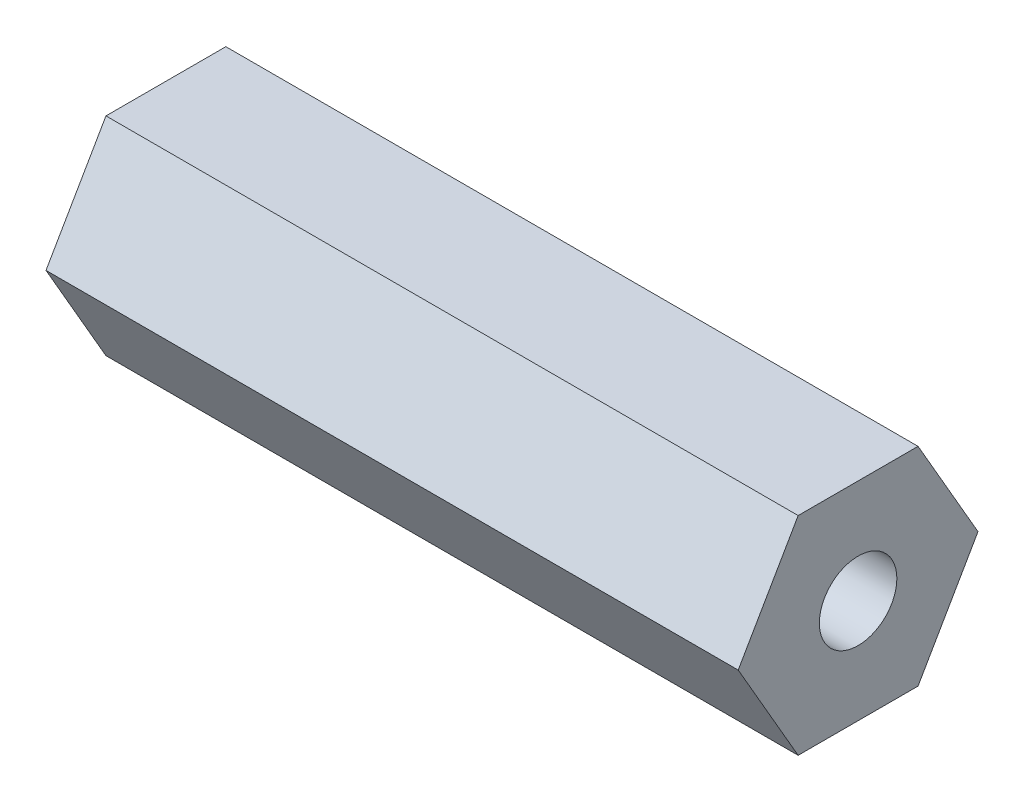
ISO-10303-21;
HEADER;
FILE_DESCRIPTION(('STEP AP214'),'2;1');
FILE_NAME('part.step','',(''),(''),'','','');
FILE_SCHEMA(('AUTOMOTIVE_DESIGN { 1 0 10303 214 1 1 1 1 }'));
ENDSEC;
DATA;
#1=APPLICATION_CONTEXT('core data for automotive mechanical design processes');
#2=APPLICATION_PROTOCOL_DEFINITION('international standard','automotive_design',2000,#1);
#3=PRODUCT_CONTEXT('',#1,'mechanical');
#4=PRODUCT('Part','Part','',(#3));
#5=PRODUCT_RELATED_PRODUCT_CATEGORY('part','',(#4));
#6=PRODUCT_DEFINITION_FORMATION('','',#4);
#7=PRODUCT_DEFINITION_CONTEXT('part definition',#1,'design');
#8=PRODUCT_DEFINITION('design','',#6,#7);
#9=PRODUCT_DEFINITION_SHAPE('','',#8);
#10=(LENGTH_UNIT() NAMED_UNIT(*) SI_UNIT(.MILLI.,.METRE.));
#11=(NAMED_UNIT(*) PLANE_ANGLE_UNIT() SI_UNIT($,.RADIAN.));
#12=(NAMED_UNIT(*) SI_UNIT($,.STERADIAN.) SOLID_ANGLE_UNIT());
#13=UNCERTAINTY_MEASURE_WITH_UNIT(LENGTH_MEASURE(1.E-05),#10,'distance_accuracy_value','');
#14=(GEOMETRIC_REPRESENTATION_CONTEXT(3) GLOBAL_UNCERTAINTY_ASSIGNED_CONTEXT((#13)) GLOBAL_UNIT_ASSIGNED_CONTEXT((#10,
#11,#12)) REPRESENTATION_CONTEXT('',''));
#15=CARTESIAN_POINT('',(0.,0.,0.));
#16=DIRECTION('',(0.,0.,1.));
#17=DIRECTION('',(1.,0.,0.));
#18=AXIS2_PLACEMENT_3D('',#15,#16,#17);
#19=CARTESIAN_POINT('',(15.875,0.,-2.74963065701559));
#20=DIRECTION('',(0.,0.5,0.866025403784438));
#21=DIRECTION('',(0.,0.866025403784439,-0.5));
#22=AXIS2_PLACEMENT_3D('',#19,#20,#21);
#23=PLANE('',#22);
#24=DIRECTION('',(0.,-0.866025403784438,0.5));
#25=VECTOR('',#24,1.);
#26=CARTESIAN_POINT('',(0.,0.,-2.74963065701559));
#27=LINE('',#26,#25);
#28=CARTESIAN_POINT('',(0.,0.,-2.74963065701559));
#29=VERTEX_POINT('',#28);
#30=CARTESIAN_POINT('',(0.,-2.38125,-1.3748153285078));
#31=VERTEX_POINT('',#30);
#32=EDGE_CURVE('E122',#29,#31,#27,.T.);
#33=ORIENTED_EDGE('',*,*,#32,.F.);
#34=DIRECTION('',(-1.,0.,0.));
#35=VECTOR('',#34,1.);
#36=CARTESIAN_POINT('',(15.875,0.,-2.74963065701559));
#37=LINE('',#36,#35);
#38=CARTESIAN_POINT('',(15.875,0.,-2.74963065701559));
#39=VERTEX_POINT('',#38);
#40=EDGE_CURVE('E121',#39,#29,#37,.T.);
#41=ORIENTED_EDGE('',*,*,#40,.F.);
#42=DIRECTION('',(0.,-0.866025403784438,0.5));
#43=VECTOR('',#42,1.);
#44=CARTESIAN_POINT('',(15.875,0.,-2.74963065701559));
#45=LINE('',#44,#43);
#46=CARTESIAN_POINT('',(15.875,-2.38125,-1.3748153285078));
#47=VERTEX_POINT('',#46);
#48=EDGE_CURVE('E135',#39,#47,#45,.T.);
#49=ORIENTED_EDGE('',*,*,#48,.T.);
#50=DIRECTION('',(-1.,0.,0.));
#51=VECTOR('',#50,1.);
#52=CARTESIAN_POINT('',(15.875,-2.38125,-1.3748153285078));
#53=LINE('',#52,#51);
#54=EDGE_CURVE('E11',#47,#31,#53,.T.);
#55=ORIENTED_EDGE('',*,*,#54,.T.);
#56=EDGE_LOOP('',(#33,#41,#49,#55));
#57=FACE_BOUND('',#56,.T.);
#58=ADVANCED_FACE('F39',(#57),#23,.F.);
#59=CARTESIAN_POINT('',(15.875,-2.38125,-1.3748153285078));
#60=DIRECTION('',(0.,1.,0.));
#61=DIRECTION('',(0.,0.,-1.));
#62=AXIS2_PLACEMENT_3D('',#59,#60,#61);
#63=PLANE('',#62);
#64=DIRECTION('',(0.,0.,1.));
#65=VECTOR('',#64,1.);
#66=CARTESIAN_POINT('',(0.,-2.38125,-1.3748153285078));
#67=LINE('',#66,#65);
#68=CARTESIAN_POINT('',(0.,-2.38125,1.3748153285078));
#69=VERTEX_POINT('',#68);
#70=EDGE_CURVE('E124',#31,#69,#67,.T.);
#71=ORIENTED_EDGE('',*,*,#70,.F.);
#72=ORIENTED_EDGE('',*,*,#54,.F.);
#73=DIRECTION('',(0.,0.,1.));
#74=VECTOR('',#73,1.);
#75=CARTESIAN_POINT('',(15.875,-2.38125,-1.3748153285078));
#76=LINE('',#75,#74);
#77=CARTESIAN_POINT('',(15.875,-2.38125,1.3748153285078));
#78=VERTEX_POINT('',#77);
#79=EDGE_CURVE('E87',#47,#78,#76,.T.);
#80=ORIENTED_EDGE('',*,*,#79,.T.);
#81=DIRECTION('',(-1.,0.,0.));
#82=VECTOR('',#81,1.);
#83=CARTESIAN_POINT('',(15.875,-2.38125,1.3748153285078));
#84=LINE('',#83,#82);
#85=EDGE_CURVE('E47',#78,#69,#84,.T.);
#86=ORIENTED_EDGE('',*,*,#85,.T.);
#87=EDGE_LOOP('',(#71,#72,#80,#86));
#88=FACE_BOUND('',#87,.T.);
#89=ADVANCED_FACE('F141',(#88),#63,.F.);
#90=CARTESIAN_POINT('',(15.875,-2.38125,1.3748153285078));
#91=DIRECTION('',(0.,0.5,-0.866025403784438));
#92=DIRECTION('',(0.,-0.866025403784439,-0.5));
#93=AXIS2_PLACEMENT_3D('',#90,#91,#92);
#94=PLANE('',#93);
#95=DIRECTION('',(0.,0.866025403784439,0.5));
#96=VECTOR('',#95,1.);
#97=CARTESIAN_POINT('',(0.,-2.38125,1.3748153285078));
#98=LINE('',#97,#96);
#99=CARTESIAN_POINT('',(0.,0.,2.74963065701559));
#100=VERTEX_POINT('',#99);
#101=EDGE_CURVE('E128',#69,#100,#98,.T.);
#102=ORIENTED_EDGE('',*,*,#101,.F.);
#103=ORIENTED_EDGE('',*,*,#85,.F.);
#104=DIRECTION('',(0.,0.866025403784439,0.5));
#105=VECTOR('',#104,1.);
#106=CARTESIAN_POINT('',(15.875,-2.38125,1.3748153285078));
#107=LINE('',#106,#105);
#108=CARTESIAN_POINT('',(15.875,0.,2.74963065701559));
#109=VERTEX_POINT('',#108);
#110=EDGE_CURVE('E115',#78,#109,#107,.T.);
#111=ORIENTED_EDGE('',*,*,#110,.T.);
#112=DIRECTION('',(-1.,0.,0.));
#113=VECTOR('',#112,1.);
#114=CARTESIAN_POINT('',(15.875,0.,2.74963065701559));
#115=LINE('',#114,#113);
#116=EDGE_CURVE('E109',#109,#100,#115,.T.);
#117=ORIENTED_EDGE('',*,*,#116,.T.);
#118=EDGE_LOOP('',(#102,#103,#111,#117));
#119=FACE_BOUND('',#118,.T.);
#120=ADVANCED_FACE('F170',(#119),#94,.F.);
#121=CARTESIAN_POINT('',(15.875,0.,2.74963065701559));
#122=DIRECTION('',(0.,-0.5,-0.866025403784438));
#123=DIRECTION('',(0.,-0.866025403784438,0.5));
#124=AXIS2_PLACEMENT_3D('',#121,#122,#123);
#125=PLANE('',#124);
#126=DIRECTION('',(0.,0.866025403784438,-0.5));
#127=VECTOR('',#126,1.);
#128=CARTESIAN_POINT('',(0.,0.,2.74963065701559));
#129=LINE('',#128,#127);
#130=CARTESIAN_POINT('',(0.,2.38125,1.37481532850779));
#131=VERTEX_POINT('',#130);
#132=EDGE_CURVE('E131',#100,#131,#129,.T.);
#133=ORIENTED_EDGE('',*,*,#132,.F.);
#134=ORIENTED_EDGE('',*,*,#116,.F.);
#135=DIRECTION('',(0.,0.866025403784438,-0.5));
#136=VECTOR('',#135,1.);
#137=CARTESIAN_POINT('',(15.875,0.,2.74963065701559));
#138=LINE('',#137,#136);
#139=CARTESIAN_POINT('',(15.875,2.38125,1.37481532850779));
#140=VERTEX_POINT('',#139);
#141=EDGE_CURVE('E99',#109,#140,#138,.T.);
#142=ORIENTED_EDGE('',*,*,#141,.T.);
#143=DIRECTION('',(-1.,0.,0.));
#144=VECTOR('',#143,1.);
#145=CARTESIAN_POINT('',(15.875,2.38125,1.37481532850779));
#146=LINE('',#145,#144);
#147=EDGE_CURVE('E104',#140,#131,#146,.T.);
#148=ORIENTED_EDGE('',*,*,#147,.T.);
#149=EDGE_LOOP('',(#133,#134,#142,#148));
#150=FACE_BOUND('',#149,.T.);
#151=ADVANCED_FACE('F112',(#150),#125,.F.);
#152=CARTESIAN_POINT('',(15.875,2.38125,1.37481532850779));
#153=DIRECTION('',(0.,-1.,0.));
#154=DIRECTION('',(0.,0.,1.));
#155=AXIS2_PLACEMENT_3D('',#152,#153,#154);
#156=PLANE('',#155);
#157=DIRECTION('',(0.,0.,-1.));
#158=VECTOR('',#157,1.);
#159=CARTESIAN_POINT('',(0.,2.38125,1.37481532850779));
#160=LINE('',#159,#158);
#161=CARTESIAN_POINT('',(0.,2.38125,-1.3748153285078));
#162=VERTEX_POINT('',#161);
#163=EDGE_CURVE('E106',#131,#162,#160,.T.);
#164=ORIENTED_EDGE('',*,*,#163,.F.);
#165=ORIENTED_EDGE('',*,*,#147,.F.);
#166=DIRECTION('',(0.,0.,-1.));
#167=VECTOR('',#166,1.);
#168=CARTESIAN_POINT('',(15.875,2.38125,1.37481532850779));
#169=LINE('',#168,#167);
#170=CARTESIAN_POINT('',(15.875,2.38125,-1.3748153285078));
#171=VERTEX_POINT('',#170);
#172=EDGE_CURVE('E95',#140,#171,#169,.T.);
#173=ORIENTED_EDGE('',*,*,#172,.T.);
#174=DIRECTION('',(-1.,0.,0.));
#175=VECTOR('',#174,1.);
#176=CARTESIAN_POINT('',(15.875,2.38125,-1.3748153285078));
#177=LINE('',#176,#175);
#178=EDGE_CURVE('E110',#171,#162,#177,.T.);
#179=ORIENTED_EDGE('',*,*,#178,.T.);
#180=EDGE_LOOP('',(#164,#165,#173,#179));
#181=FACE_BOUND('',#180,.T.);
#182=ADVANCED_FACE('F105',(#181),#156,.F.);
#183=CARTESIAN_POINT('',(15.875,2.38125,-1.3748153285078));
#184=DIRECTION('',(0.,-0.5,0.866025403784439));
#185=DIRECTION('',(0.,0.866025403784439,0.5));
#186=AXIS2_PLACEMENT_3D('',#183,#184,#185);
#187=PLANE('',#186);
#188=DIRECTION('',(0.,-0.866025403784439,-0.5));
#189=VECTOR('',#188,1.);
#190=CARTESIAN_POINT('',(0.,2.38125,-1.3748153285078));
#191=LINE('',#190,#189);
#192=EDGE_CURVE('E75',#162,#29,#191,.T.);
#193=ORIENTED_EDGE('',*,*,#192,.F.);
#194=ORIENTED_EDGE('',*,*,#178,.F.);
#195=DIRECTION('',(0.,-0.866025403784439,-0.5));
#196=VECTOR('',#195,1.);
#197=CARTESIAN_POINT('',(15.875,2.38125,-1.3748153285078));
#198=LINE('',#197,#196);
#199=EDGE_CURVE('E55',#171,#39,#198,.T.);
#200=ORIENTED_EDGE('',*,*,#199,.T.);
#201=ORIENTED_EDGE('',*,*,#40,.T.);
#202=EDGE_LOOP('',(#193,#194,#200,#201));
#203=FACE_BOUND('',#202,.T.);
#204=ADVANCED_FACE('F180',(#203),#187,.F.);
#205=CARTESIAN_POINT('',(15.875,0.,0.));
#206=DIRECTION('',(1.,0.,0.));
#207=DIRECTION('',(0.,0.,1.));
#208=AXIS2_PLACEMENT_3D('',#205,#206,#207);
#209=PLANE('',#208);
#210=CARTESIAN_POINT('',(15.875,0.,0.));
#211=DIRECTION('',(1.,0.,0.));
#212=DIRECTION('',(0.,0.,-1.));
#213=AXIS2_PLACEMENT_3D('',#210,#211,#212);
#214=CIRCLE('',#213,0.888999999999996);
#215=CARTESIAN_POINT('',(15.875,0.,-0.888999999999996));
#216=VERTEX_POINT('',#215);
#217=EDGE_CURVE('E125',#216,#216,#214,.T.);
#218=ORIENTED_EDGE('',*,*,#217,.F.);
#219=EDGE_LOOP('',(#218));
#220=FACE_BOUND('',#219,.T.);
#221=ORIENTED_EDGE('',*,*,#48,.F.);
#222=ORIENTED_EDGE('',*,*,#199,.F.);
#223=ORIENTED_EDGE('',*,*,#172,.F.);
#224=ORIENTED_EDGE('',*,*,#141,.F.);
#225=ORIENTED_EDGE('',*,*,#110,.F.);
#226=ORIENTED_EDGE('',*,*,#79,.F.);
#227=EDGE_LOOP('',(#221,#222,#223,#224,#225,#226));
#228=FACE_BOUND('',#227,.T.);
#229=ADVANCED_FACE('F97',(#220,#228),#209,.T.);
#230=CARTESIAN_POINT('',(0.,0.,0.));
#231=DIRECTION('',(1.,0.,0.));
#232=DIRECTION('',(0.,0.,1.));
#233=AXIS2_PLACEMENT_3D('',#230,#231,#232);
#234=PLANE('',#233);
#235=CARTESIAN_POINT('',(0.,0.,0.));
#236=DIRECTION('',(1.,0.,0.));
#237=DIRECTION('',(0.,0.,-1.));
#238=AXIS2_PLACEMENT_3D('',#235,#236,#237);
#239=CIRCLE('',#238,0.888999999999987);
#240=CARTESIAN_POINT('',(0.,0.,-0.888999999999987));
#241=VERTEX_POINT('',#240);
#242=EDGE_CURVE('E152',#241,#241,#239,.T.);
#243=ORIENTED_EDGE('',*,*,#242,.T.);
#244=EDGE_LOOP('',(#243));
#245=FACE_BOUND('',#244,.T.);
#246=ORIENTED_EDGE('',*,*,#32,.T.);
#247=ORIENTED_EDGE('',*,*,#70,.T.);
#248=ORIENTED_EDGE('',*,*,#101,.T.);
#249=ORIENTED_EDGE('',*,*,#132,.T.);
#250=ORIENTED_EDGE('',*,*,#163,.T.);
#251=ORIENTED_EDGE('',*,*,#192,.T.);
#252=EDGE_LOOP('',(#246,#247,#248,#249,#250,#251));
#253=FACE_BOUND('',#252,.T.);
#254=ADVANCED_FACE('F143',(#245,#253),#234,.F.);
#255=CARTESIAN_POINT('',(0.,0.,0.));
#256=DIRECTION('',(-1.,0.,0.));
#257=DIRECTION('',(0.,0.,-1.));
#258=AXIS2_PLACEMENT_3D('',#255,#256,#257);
#259=CYLINDRICAL_SURFACE('',#258,0.888999999999991);
#260=ORIENTED_EDGE('',*,*,#217,.T.);
#261=EDGE_LOOP('',(#260));
#262=FACE_BOUND('',#261,.T.);
#263=ORIENTED_EDGE('',*,*,#242,.F.);
#264=EDGE_LOOP('',(#263));
#265=FACE_BOUND('',#264,.T.);
#266=ADVANCED_FACE('F157',(#262,#265),#259,.F.);
#267=CLOSED_SHELL('',(#58,#89,#120,#151,#182,#204,#229,#254,#266));
#268=MANIFOLD_SOLID_BREP('B2',#267);
#269=ADVANCED_BREP_SHAPE_REPRESENTATION('',(#18,#268),#14);
#270=SHAPE_DEFINITION_REPRESENTATION(#9,#269);
ENDSEC;
END-ISO-10303-21;
